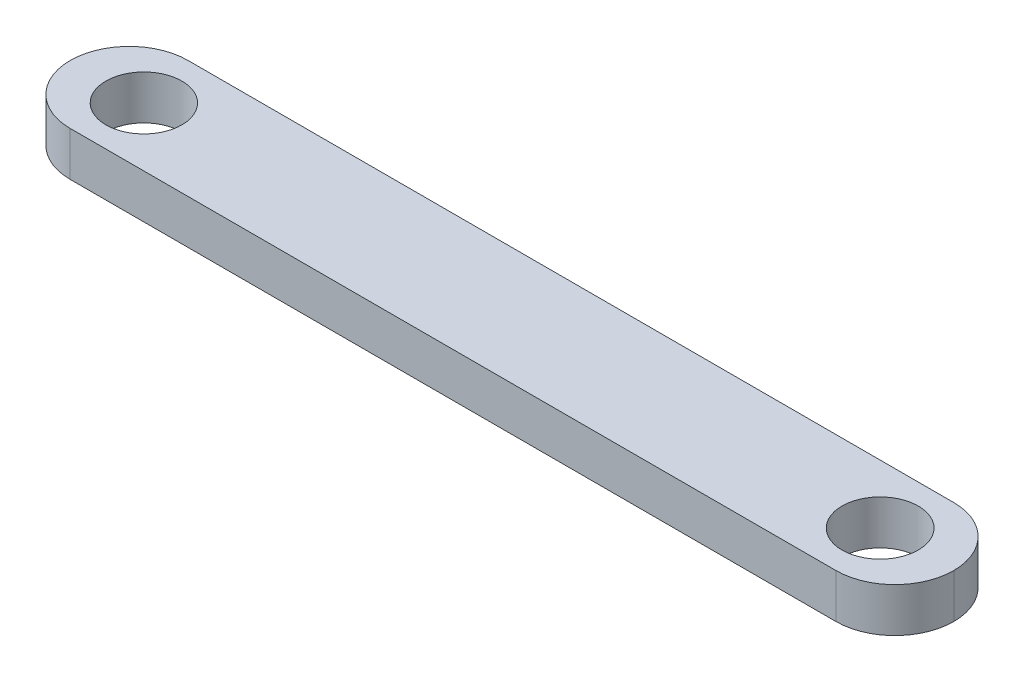
ISO-10303-21;
HEADER;
FILE_DESCRIPTION(('STEP AP214'),'2;1');
FILE_NAME('part.step','',(''),(''),'','','');
FILE_SCHEMA(('AUTOMOTIVE_DESIGN { 1 0 10303 214 1 1 1 1 }'));
ENDSEC;
DATA;
#1=APPLICATION_CONTEXT('core data for automotive mechanical design processes');
#2=APPLICATION_PROTOCOL_DEFINITION('international standard','automotive_design',2000,#1);
#3=PRODUCT_CONTEXT('',#1,'mechanical');
#4=PRODUCT('Part','Part','',(#3));
#5=PRODUCT_RELATED_PRODUCT_CATEGORY('part','',(#4));
#6=PRODUCT_DEFINITION_FORMATION('','',#4);
#7=PRODUCT_DEFINITION_CONTEXT('part definition',#1,'design');
#8=PRODUCT_DEFINITION('design','',#6,#7);
#9=PRODUCT_DEFINITION_SHAPE('','',#8);
#10=(LENGTH_UNIT() NAMED_UNIT(*) SI_UNIT(.MILLI.,.METRE.));
#11=(NAMED_UNIT(*) PLANE_ANGLE_UNIT() SI_UNIT($,.RADIAN.));
#12=(NAMED_UNIT(*) SI_UNIT($,.STERADIAN.) SOLID_ANGLE_UNIT());
#13=UNCERTAINTY_MEASURE_WITH_UNIT(LENGTH_MEASURE(1.E-05),#10,'distance_accuracy_value','');
#14=(GEOMETRIC_REPRESENTATION_CONTEXT(3) GLOBAL_UNCERTAINTY_ASSIGNED_CONTEXT((#13)) GLOBAL_UNIT_ASSIGNED_CONTEXT((#10,
#11,#12)) REPRESENTATION_CONTEXT('',''));
#15=CARTESIAN_POINT('',(0.,0.,0.));
#16=DIRECTION('',(0.,0.,1.));
#17=DIRECTION('',(1.,0.,0.));
#18=AXIS2_PLACEMENT_3D('',#15,#16,#17);
#19=CARTESIAN_POINT('',(0.,3.,0.));
#20=DIRECTION('',(0.,-1.,0.));
#21=DIRECTION('',(0.,0.,-1.));
#22=AXIS2_PLACEMENT_3D('',#19,#20,#21);
#23=PLANE('',#22);
#24=CARTESIAN_POINT('',(26.,3.,0.));
#25=DIRECTION('',(0.,-1.,0.));
#26=DIRECTION('',(0.,0.,-1.));
#27=AXIS2_PLACEMENT_3D('',#24,#25,#26);
#28=CIRCLE('',#27,4.);
#29=CARTESIAN_POINT('',(26.,3.,4.));
#30=VERTEX_POINT('',#29);
#31=CARTESIAN_POINT('',(30.,3.,0.));
#32=VERTEX_POINT('',#31);
#33=EDGE_CURVE('E143',#30,#32,#28,.F.);
#34=ORIENTED_EDGE('',*,*,#33,.T.);
#35=CARTESIAN_POINT('',(26.,3.,0.));
#36=DIRECTION('',(0.,-1.,0.));
#37=DIRECTION('',(0.,0.,-1.));
#38=AXIS2_PLACEMENT_3D('',#35,#36,#37);
#39=CIRCLE('',#38,4.);
#40=CARTESIAN_POINT('',(26.,3.,-4.));
#41=VERTEX_POINT('',#40);
#42=EDGE_CURVE('E141',#32,#41,#39,.F.);
#43=ORIENTED_EDGE('',*,*,#42,.T.);
#44=DIRECTION('',(-1.,0.,0.));
#45=VECTOR('',#44,1.);
#46=CARTESIAN_POINT('',(-30.,3.,-4.));
#47=LINE('',#46,#45);
#48=CARTESIAN_POINT('',(-26.,3.,-4.));
#49=VERTEX_POINT('',#48);
#50=EDGE_CURVE('E113',#41,#49,#47,.T.);
#51=ORIENTED_EDGE('',*,*,#50,.T.);
#52=CARTESIAN_POINT('',(-26.,3.,0.));
#53=DIRECTION('',(0.,-1.,0.));
#54=DIRECTION('',(0.,0.,-1.));
#55=AXIS2_PLACEMENT_3D('',#52,#53,#54);
#56=CIRCLE('',#55,4.);
#57=CARTESIAN_POINT('',(-30.,3.,0.));
#58=VERTEX_POINT('',#57);
#59=EDGE_CURVE('E136',#49,#58,#56,.F.);
#60=ORIENTED_EDGE('',*,*,#59,.T.);
#61=CARTESIAN_POINT('',(-26.,3.,0.));
#62=DIRECTION('',(0.,-1.,0.));
#63=DIRECTION('',(0.,0.,-1.));
#64=AXIS2_PLACEMENT_3D('',#61,#62,#63);
#65=CIRCLE('',#64,4.);
#66=CARTESIAN_POINT('',(-26.,3.,4.));
#67=VERTEX_POINT('',#66);
#68=EDGE_CURVE('E63',#58,#67,#65,.F.);
#69=ORIENTED_EDGE('',*,*,#68,.T.);
#70=DIRECTION('',(1.,0.,0.));
#71=VECTOR('',#70,1.);
#72=CARTESIAN_POINT('',(-30.,3.,4.));
#73=LINE('',#72,#71);
#74=EDGE_CURVE('E132',#67,#30,#73,.T.);
#75=ORIENTED_EDGE('',*,*,#74,.T.);
#76=EDGE_LOOP('',(#34,#43,#51,#60,#69,#75));
#77=FACE_BOUND('',#76,.T.);
#78=CARTESIAN_POINT('',(-25.,3.,0.));
#79=DIRECTION('',(0.,1.,0.));
#80=DIRECTION('',(0.,0.,1.));
#81=AXIS2_PLACEMENT_3D('',#78,#79,#80);
#82=CIRCLE('',#81,2.58);
#83=CARTESIAN_POINT('',(-25.,3.,2.58));
#84=VERTEX_POINT('',#83);
#85=EDGE_CURVE('E121',#84,#84,#82,.T.);
#86=ORIENTED_EDGE('',*,*,#85,.F.);
#87=EDGE_LOOP('',(#86));
#88=FACE_BOUND('',#87,.T.);
#89=CARTESIAN_POINT('',(25.,3.,0.));
#90=DIRECTION('',(0.,1.,0.));
#91=DIRECTION('',(0.,0.,1.));
#92=AXIS2_PLACEMENT_3D('',#89,#90,#91);
#93=CIRCLE('',#92,2.58999999999999);
#94=CARTESIAN_POINT('',(25.,3.,2.58999999999998));
#95=VERTEX_POINT('',#94);
#96=EDGE_CURVE('E150',#95,#95,#93,.T.);
#97=ORIENTED_EDGE('',*,*,#96,.F.);
#98=EDGE_LOOP('',(#97));
#99=FACE_BOUND('',#98,.T.);
#100=ADVANCED_FACE('F41',(#77,#88,#99),#23,.F.);
#101=CARTESIAN_POINT('',(0.,0.,0.));
#102=DIRECTION('',(0.,-1.,0.));
#103=DIRECTION('',(0.,0.,-1.));
#104=AXIS2_PLACEMENT_3D('',#101,#102,#103);
#105=PLANE('',#104);
#106=CARTESIAN_POINT('',(-25.,0.,0.));
#107=DIRECTION('',(0.,1.,0.));
#108=DIRECTION('',(0.,0.,1.));
#109=AXIS2_PLACEMENT_3D('',#106,#107,#108);
#110=CIRCLE('',#109,2.58);
#111=CARTESIAN_POINT('',(-25.,0.,2.58));
#112=VERTEX_POINT('',#111);
#113=EDGE_CURVE('E126',#112,#112,#110,.T.);
#114=ORIENTED_EDGE('',*,*,#113,.T.);
#115=EDGE_LOOP('',(#114));
#116=FACE_BOUND('',#115,.T.);
#117=DIRECTION('',(-1.,0.,0.));
#118=VECTOR('',#117,1.);
#119=CARTESIAN_POINT('',(-30.,0.,-4.));
#120=LINE('',#119,#118);
#121=CARTESIAN_POINT('',(26.,0.,-4.));
#122=VERTEX_POINT('',#121);
#123=CARTESIAN_POINT('',(-26.,0.,-4.));
#124=VERTEX_POINT('',#123);
#125=EDGE_CURVE('E115',#122,#124,#120,.T.);
#126=ORIENTED_EDGE('',*,*,#125,.F.);
#127=CARTESIAN_POINT('',(26.,0.,0.));
#128=DIRECTION('',(0.,-1.,0.));
#129=DIRECTION('',(0.,0.,-1.));
#130=AXIS2_PLACEMENT_3D('',#127,#128,#129);
#131=CIRCLE('',#130,4.);
#132=CARTESIAN_POINT('',(30.,0.,0.));
#133=VERTEX_POINT('',#132);
#134=EDGE_CURVE('E92',#122,#133,#131,.T.);
#135=ORIENTED_EDGE('',*,*,#134,.T.);
#136=CARTESIAN_POINT('',(26.,0.,0.));
#137=DIRECTION('',(0.,-1.,0.));
#138=DIRECTION('',(0.,0.,-1.));
#139=AXIS2_PLACEMENT_3D('',#136,#137,#138);
#140=CIRCLE('',#139,4.);
#141=CARTESIAN_POINT('',(26.,0.,4.));
#142=VERTEX_POINT('',#141);
#143=EDGE_CURVE('E104',#133,#142,#140,.T.);
#144=ORIENTED_EDGE('',*,*,#143,.T.);
#145=DIRECTION('',(1.,0.,0.));
#146=VECTOR('',#145,1.);
#147=CARTESIAN_POINT('',(-30.,0.,4.));
#148=LINE('',#147,#146);
#149=CARTESIAN_POINT('',(-26.,0.,4.));
#150=VERTEX_POINT('',#149);
#151=EDGE_CURVE('E125',#150,#142,#148,.T.);
#152=ORIENTED_EDGE('',*,*,#151,.F.);
#153=CARTESIAN_POINT('',(-26.,0.,0.));
#154=DIRECTION('',(0.,-1.,0.));
#155=DIRECTION('',(0.,0.,-1.));
#156=AXIS2_PLACEMENT_3D('',#153,#154,#155);
#157=CIRCLE('',#156,4.);
#158=CARTESIAN_POINT('',(-30.,0.,0.));
#159=VERTEX_POINT('',#158);
#160=EDGE_CURVE('E117',#150,#159,#157,.T.);
#161=ORIENTED_EDGE('',*,*,#160,.T.);
#162=CARTESIAN_POINT('',(-26.,0.,0.));
#163=DIRECTION('',(0.,-1.,0.));
#164=DIRECTION('',(0.,0.,-1.));
#165=AXIS2_PLACEMENT_3D('',#162,#163,#164);
#166=CIRCLE('',#165,4.);
#167=EDGE_CURVE('E124',#159,#124,#166,.T.);
#168=ORIENTED_EDGE('',*,*,#167,.T.);
#169=EDGE_LOOP('',(#126,#135,#144,#152,#161,#168));
#170=FACE_BOUND('',#169,.T.);
#171=CARTESIAN_POINT('',(25.,0.,0.));
#172=DIRECTION('',(0.,1.,0.));
#173=DIRECTION('',(0.,0.,1.));
#174=AXIS2_PLACEMENT_3D('',#171,#172,#173);
#175=CIRCLE('',#174,2.58999999999999);
#176=CARTESIAN_POINT('',(25.,0.,2.58999999999998));
#177=VERTEX_POINT('',#176);
#178=EDGE_CURVE('E144',#177,#177,#175,.T.);
#179=ORIENTED_EDGE('',*,*,#178,.T.);
#180=EDGE_LOOP('',(#179));
#181=FACE_BOUND('',#180,.T.);
#182=ADVANCED_FACE('F119',(#116,#170,#181),#105,.T.);
#183=CARTESIAN_POINT('',(-30.,3.,-4.));
#184=DIRECTION('',(0.,0.,1.));
#185=DIRECTION('',(1.,0.,0.));
#186=AXIS2_PLACEMENT_3D('',#183,#184,#185);
#187=PLANE('',#186);
#188=ORIENTED_EDGE('',*,*,#50,.F.);
#189=DIRECTION('',(0.,-1.,0.));
#190=VECTOR('',#189,1.);
#191=CARTESIAN_POINT('',(26.,3.,-4.));
#192=LINE('',#191,#190);
#193=EDGE_CURVE('E97',#41,#122,#192,.T.);
#194=ORIENTED_EDGE('',*,*,#193,.T.);
#195=ORIENTED_EDGE('',*,*,#125,.T.);
#196=DIRECTION('',(0.,-1.,0.));
#197=VECTOR('',#196,1.);
#198=CARTESIAN_POINT('',(-26.,3.,-4.));
#199=LINE('',#198,#197);
#200=EDGE_CURVE('E120',#124,#49,#199,.F.);
#201=ORIENTED_EDGE('',*,*,#200,.T.);
#202=EDGE_LOOP('',(#188,#194,#195,#201));
#203=FACE_BOUND('',#202,.T.);
#204=ADVANCED_FACE('F109',(#203),#187,.F.);
#205=CARTESIAN_POINT('',(-30.,3.,4.));
#206=DIRECTION('',(0.,0.,-1.));
#207=DIRECTION('',(-1.,0.,0.));
#208=AXIS2_PLACEMENT_3D('',#205,#206,#207);
#209=PLANE('',#208);
#210=ORIENTED_EDGE('',*,*,#151,.T.);
#211=DIRECTION('',(0.,-1.,0.));
#212=VECTOR('',#211,1.);
#213=CARTESIAN_POINT('',(26.,3.,4.));
#214=LINE('',#213,#212);
#215=EDGE_CURVE('E11',#142,#30,#214,.F.);
#216=ORIENTED_EDGE('',*,*,#215,.T.);
#217=ORIENTED_EDGE('',*,*,#74,.F.);
#218=DIRECTION('',(0.,-1.,0.));
#219=VECTOR('',#218,1.);
#220=CARTESIAN_POINT('',(-26.,3.,4.));
#221=LINE('',#220,#219);
#222=EDGE_CURVE('E49',#67,#150,#221,.T.);
#223=ORIENTED_EDGE('',*,*,#222,.T.);
#224=EDGE_LOOP('',(#210,#216,#217,#223));
#225=FACE_BOUND('',#224,.T.);
#226=ADVANCED_FACE('F160',(#225),#209,.F.);
#227=CARTESIAN_POINT('',(-25.,3.,0.));
#228=DIRECTION('',(0.,-1.,0.));
#229=DIRECTION('',(0.,0.,-1.));
#230=AXIS2_PLACEMENT_3D('',#227,#228,#229);
#231=CYLINDRICAL_SURFACE('',#230,2.58);
#232=ORIENTED_EDGE('',*,*,#85,.T.);
#233=EDGE_LOOP('',(#232));
#234=FACE_BOUND('',#233,.T.);
#235=ORIENTED_EDGE('',*,*,#113,.F.);
#236=EDGE_LOOP('',(#235));
#237=FACE_BOUND('',#236,.T.);
#238=ADVANCED_FACE('F178',(#234,#237),#231,.F.);
#239=CARTESIAN_POINT('',(25.,3.,0.));
#240=DIRECTION('',(0.,-1.,0.));
#241=DIRECTION('',(0.,0.,-1.));
#242=AXIS2_PLACEMENT_3D('',#239,#240,#241);
#243=CYLINDRICAL_SURFACE('',#242,2.58999999999999);
#244=ORIENTED_EDGE('',*,*,#96,.T.);
#245=EDGE_LOOP('',(#244));
#246=FACE_BOUND('',#245,.T.);
#247=ORIENTED_EDGE('',*,*,#178,.F.);
#248=EDGE_LOOP('',(#247));
#249=FACE_BOUND('',#248,.T.);
#250=ADVANCED_FACE('F169',(#246,#249),#243,.F.);
#251=CARTESIAN_POINT('',(26.,3.,0.));
#252=DIRECTION('',(0.,-1.,0.));
#253=DIRECTION('',(0.,0.,-1.));
#254=AXIS2_PLACEMENT_3D('',#251,#252,#253);
#255=CYLINDRICAL_SURFACE('',#254,4.);
#256=DIRECTION('',(0.,-1.,0.));
#257=VECTOR('',#256,1.);
#258=CARTESIAN_POINT('',(30.,3.,0.));
#259=LINE('',#258,#257);
#260=EDGE_CURVE('E101',#32,#133,#259,.T.);
#261=ORIENTED_EDGE('',*,*,#260,.F.);
#262=ORIENTED_EDGE('',*,*,#33,.F.);
#263=ORIENTED_EDGE('',*,*,#215,.F.);
#264=ORIENTED_EDGE('',*,*,#143,.F.);
#265=EDGE_LOOP('',(#261,#262,#263,#264));
#266=FACE_BOUND('',#265,.T.);
#267=ADVANCED_FACE('F157',(#266),#255,.T.);
#268=CARTESIAN_POINT('',(26.,3.,0.));
#269=DIRECTION('',(0.,-1.,0.));
#270=DIRECTION('',(0.,0.,-1.));
#271=AXIS2_PLACEMENT_3D('',#268,#269,#270);
#272=CYLINDRICAL_SURFACE('',#271,4.);
#273=ORIENTED_EDGE('',*,*,#42,.F.);
#274=ORIENTED_EDGE('',*,*,#260,.T.);
#275=ORIENTED_EDGE('',*,*,#134,.F.);
#276=ORIENTED_EDGE('',*,*,#193,.F.);
#277=EDGE_LOOP('',(#273,#274,#275,#276));
#278=FACE_BOUND('',#277,.T.);
#279=ADVANCED_FACE('F98',(#278),#272,.T.);
#280=CARTESIAN_POINT('',(-26.,3.,0.));
#281=DIRECTION('',(0.,-1.,0.));
#282=DIRECTION('',(0.,0.,-1.));
#283=AXIS2_PLACEMENT_3D('',#280,#281,#282);
#284=CYLINDRICAL_SURFACE('',#283,4.);
#285=ORIENTED_EDGE('',*,*,#222,.F.);
#286=ORIENTED_EDGE('',*,*,#68,.F.);
#287=DIRECTION('',(0.,-1.,0.));
#288=VECTOR('',#287,1.);
#289=CARTESIAN_POINT('',(-30.,3.,0.));
#290=LINE('',#289,#288);
#291=EDGE_CURVE('E44',#159,#58,#290,.F.);
#292=ORIENTED_EDGE('',*,*,#291,.F.);
#293=ORIENTED_EDGE('',*,*,#160,.F.);
#294=EDGE_LOOP('',(#285,#286,#292,#293));
#295=FACE_BOUND('',#294,.T.);
#296=ADVANCED_FACE('F43',(#295),#284,.T.);
#297=CARTESIAN_POINT('',(-26.,3.,0.));
#298=DIRECTION('',(0.,-1.,0.));
#299=DIRECTION('',(0.,0.,-1.));
#300=AXIS2_PLACEMENT_3D('',#297,#298,#299);
#301=CYLINDRICAL_SURFACE('',#300,4.);
#302=ORIENTED_EDGE('',*,*,#59,.F.);
#303=ORIENTED_EDGE('',*,*,#200,.F.);
#304=ORIENTED_EDGE('',*,*,#167,.F.);
#305=ORIENTED_EDGE('',*,*,#291,.T.);
#306=EDGE_LOOP('',(#302,#303,#304,#305));
#307=FACE_BOUND('',#306,.T.);
#308=ADVANCED_FACE('F155',(#307),#301,.T.);
#309=CLOSED_SHELL('',(#100,#182,#204,#226,#238,#250,#267,#279,#296,#308));
#310=MANIFOLD_SOLID_BREP('B2',#309);
#311=ADVANCED_BREP_SHAPE_REPRESENTATION('',(#18,#310),#14);
#312=SHAPE_DEFINITION_REPRESENTATION(#9,#311);
ENDSEC;
END-ISO-10303-21;
